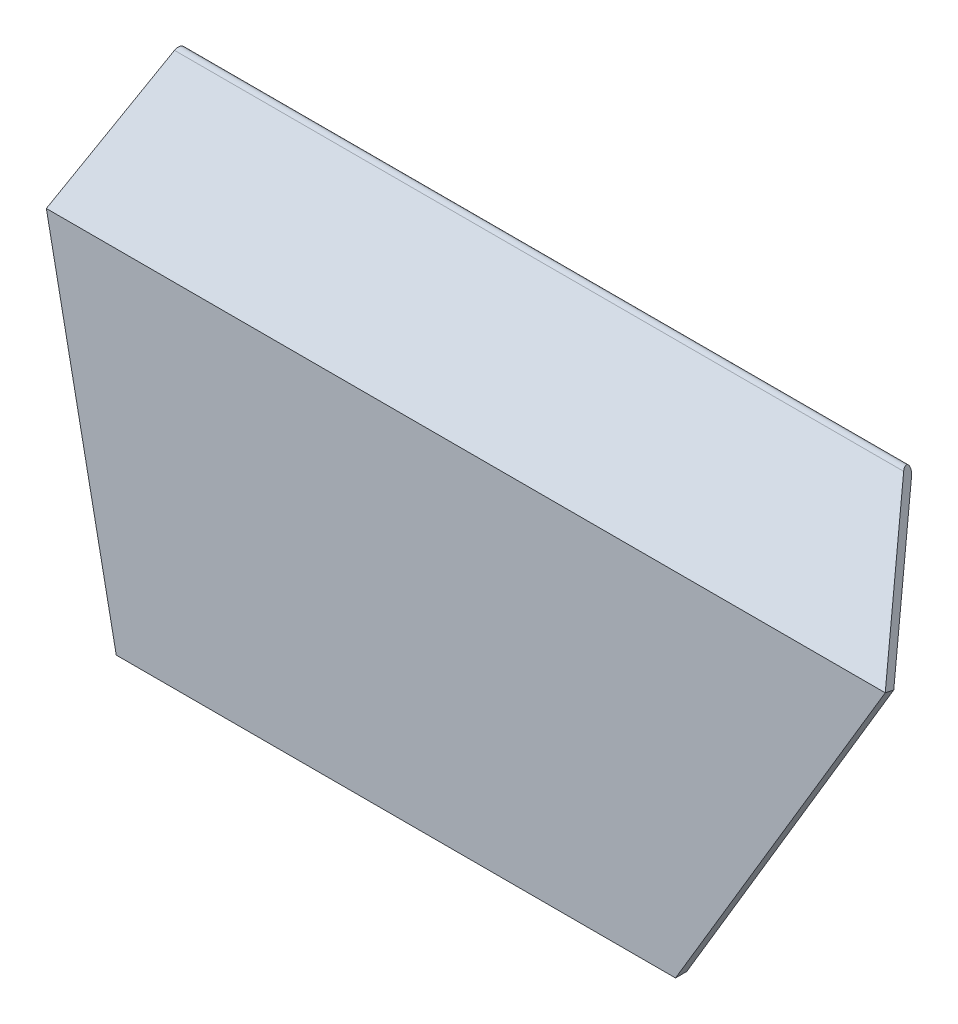
ISO-10303-21;
HEADER;
FILE_DESCRIPTION(('STEP AP214'),'2;1');
FILE_NAME('part.step','',(''),(''),'','','');
FILE_SCHEMA(('AUTOMOTIVE_DESIGN { 1 0 10303 214 1 1 1 1 }'));
ENDSEC;
DATA;
#1=APPLICATION_CONTEXT('core data for automotive mechanical design processes');
#2=APPLICATION_PROTOCOL_DEFINITION('international standard','automotive_design',2000,#1);
#3=PRODUCT_CONTEXT('',#1,'mechanical');
#4=PRODUCT('Part','Part','',(#3));
#5=PRODUCT_RELATED_PRODUCT_CATEGORY('part','',(#4));
#6=PRODUCT_DEFINITION_FORMATION('','',#4);
#7=PRODUCT_DEFINITION_CONTEXT('part definition',#1,'design');
#8=PRODUCT_DEFINITION('design','',#6,#7);
#9=PRODUCT_DEFINITION_SHAPE('','',#8);
#10=(LENGTH_UNIT() NAMED_UNIT(*) SI_UNIT(.MILLI.,.METRE.));
#11=(NAMED_UNIT(*) PLANE_ANGLE_UNIT() SI_UNIT($,.RADIAN.));
#12=(NAMED_UNIT(*) SI_UNIT($,.STERADIAN.) SOLID_ANGLE_UNIT());
#13=UNCERTAINTY_MEASURE_WITH_UNIT(LENGTH_MEASURE(1.E-05),#10,'distance_accuracy_value','');
#14=(GEOMETRIC_REPRESENTATION_CONTEXT(3) GLOBAL_UNCERTAINTY_ASSIGNED_CONTEXT((#13)) GLOBAL_UNIT_ASSIGNED_CONTEXT((#10,
#11,#12)) REPRESENTATION_CONTEXT('',''));
#15=CARTESIAN_POINT('',(0.,0.,0.));
#16=DIRECTION('',(0.,0.,1.));
#17=DIRECTION('',(1.,0.,0.));
#18=AXIS2_PLACEMENT_3D('',#15,#16,#17);
#19=CARTESIAN_POINT('',(600.,0.,8.));
#20=DIRECTION('',(0.,1.,0.));
#21=DIRECTION('',(0.,0.,1.));
#22=AXIS2_PLACEMENT_3D('',#19,#20,#21);
#23=PLANE('',#22);
#24=DIRECTION('',(-1.,0.,0.));
#25=VECTOR('',#24,1.);
#26=CARTESIAN_POINT('',(600.,0.,8.));
#27=LINE('',#26,#25);
#28=CARTESIAN_POINT('',(300.,1.09287578986539E-13,8.));
#29=VERTEX_POINT('',#28);
#30=CARTESIAN_POINT('',(-500.,0.,8.));
#31=VERTEX_POINT('',#30);
#32=EDGE_CURVE('E131',#29,#31,#27,.T.);
#33=ORIENTED_EDGE('',*,*,#32,.T.);
#34=DIRECTION('',(0.,0.,1.));
#35=VECTOR('',#34,1.);
#36=CARTESIAN_POINT('',(-500.,0.,-593.939151416767));
#37=LINE('',#36,#35);
#38=CARTESIAN_POINT('',(-500.,0.,-8.00000000000001));
#39=VERTEX_POINT('',#38);
#40=EDGE_CURVE('E122',#39,#31,#37,.T.);
#41=ORIENTED_EDGE('',*,*,#40,.F.);
#42=DIRECTION('',(-1.,0.,0.));
#43=VECTOR('',#42,1.);
#44=CARTESIAN_POINT('',(600.,0.,-8.));
#45=LINE('',#44,#43);
#46=CARTESIAN_POINT('',(300.,1.09287578986539E-13,-8.00000000000001));
#47=VERTEX_POINT('',#46);
#48=EDGE_CURVE('E143',#47,#39,#45,.T.);
#49=ORIENTED_EDGE('',*,*,#48,.F.);
#50=DIRECTION('',(0.,0.,1.));
#51=VECTOR('',#50,1.);
#52=CARTESIAN_POINT('',(300.,1.09287578986539E-13,-593.939151416767));
#53=LINE('',#52,#51);
#54=EDGE_CURVE('E175',#47,#29,#53,.T.);
#55=ORIENTED_EDGE('',*,*,#54,.T.);
#56=EDGE_LOOP('',(#33,#41,#49,#55));
#57=FACE_BOUND('',#56,.T.);
#58=ADVANCED_FACE('F36',(#57),#23,.F.);
#59=CARTESIAN_POINT('',(600.,0.,-8.));
#60=DIRECTION('',(0.,0.,1.));
#61=DIRECTION('',(1.,0.,0.));
#62=AXIS2_PLACEMENT_3D('',#59,#60,#61);
#63=PLANE('',#62);
#64=CARTESIAN_POINT('',(-176.078720832928,79.0205346036378,-8.));
#65=DIRECTION('',(0.,0.,-1.));
#66=DIRECTION('',(-1.,0.,0.));
#67=AXIS2_PLACEMENT_3D('',#64,#65,#66);
#68=CIRCLE('',#67,16.);
#69=CARTESIAN_POINT('',(-192.078720832928,79.0205346036378,-8.));
#70=VERTEX_POINT('',#69);
#71=EDGE_CURVE('E369',#70,#70,#68,.T.);
#72=ORIENTED_EDGE('',*,*,#71,.F.);
#73=EDGE_LOOP('',(#72));
#74=FACE_BOUND('',#73,.T.);
#75=CARTESIAN_POINT('',(-430.637162060085,333.578975830795,-8.));
#76=DIRECTION('',(0.,0.,-1.));
#77=DIRECTION('',(-1.,0.,0.));
#78=AXIS2_PLACEMENT_3D('',#75,#76,#77);
#79=CIRCLE('',#78,16.);
#80=CARTESIAN_POINT('',(-446.637162060085,333.578975830795,-8.));
#81=VERTEX_POINT('',#80);
#82=EDGE_CURVE('E382',#81,#81,#79,.T.);
#83=ORIENTED_EDGE('',*,*,#82,.F.);
#84=EDGE_LOOP('',(#83));
#85=FACE_BOUND('',#84,.T.);
#86=CARTESIAN_POINT('',(-430.637162060085,79.0205346036377,-8.));
#87=DIRECTION('',(0.,0.,-1.));
#88=DIRECTION('',(-1.,0.,0.));
#89=AXIS2_PLACEMENT_3D('',#86,#87,#88);
#90=CIRCLE('',#89,16.);
#91=CARTESIAN_POINT('',(-446.637162060085,79.0205346036377,-8.));
#92=VERTEX_POINT('',#91);
#93=EDGE_CURVE('E377',#92,#92,#90,.T.);
#94=ORIENTED_EDGE('',*,*,#93,.F.);
#95=EDGE_LOOP('',(#94));
#96=FACE_BOUND('',#95,.T.);
#97=CARTESIAN_POINT('',(-176.078720832928,333.578975830795,-8.));
#98=DIRECTION('',(0.,0.,-1.));
#99=DIRECTION('',(-1.,0.,0.));
#100=AXIS2_PLACEMENT_3D('',#97,#98,#99);
#101=CIRCLE('',#100,16.0000000000001);
#102=CARTESIAN_POINT('',(-192.078720832928,333.578975830795,-8.));
#103=VERTEX_POINT('',#102);
#104=EDGE_CURVE('E368',#103,#103,#101,.T.);
#105=ORIENTED_EDGE('',*,*,#104,.F.);
#106=EDGE_LOOP('',(#105));
#107=FACE_BOUND('',#106,.T.);
#108=ORIENTED_EDGE('',*,*,#48,.T.);
#109=DIRECTION('',(0.194874139230408,-0.980828257066041,0.));
#110=VECTOR('',#109,1.);
#111=CARTESIAN_POINT('',(-600.,503.313708498985,-8.00000000000001));
#112=LINE('',#111,#110);
#113=CARTESIAN_POINT('',(-598.683243296167,496.686291501015,-8.));
#114=VERTEX_POINT('',#113);
#115=EDGE_CURVE('E171',#114,#39,#112,.T.);
#116=ORIENTED_EDGE('',*,*,#115,.F.);
#117=DIRECTION('',(-1.,0.,0.));
#118=VECTOR('',#117,1.);
#119=CARTESIAN_POINT('',(600.,496.686291501015,-8.));
#120=LINE('',#119,#118);
#121=CARTESIAN_POINT('',(596.049729888502,496.686291501015,-8.));
#122=VERTEX_POINT('',#121);
#123=EDGE_CURVE('E141',#122,#114,#120,.T.);
#124=ORIENTED_EDGE('',*,*,#123,.F.);
#125=DIRECTION('',(0.511998556974077,0.858986308189172,0.));
#126=VECTOR('',#125,1.);
#127=CARTESIAN_POINT('',(600.,503.313708498985,-8.00000000000001));
#128=LINE('',#127,#126);
#129=EDGE_CURVE('E126',#47,#122,#128,.T.);
#130=ORIENTED_EDGE('',*,*,#129,.F.);
#131=EDGE_LOOP('',(#108,#116,#124,#130));
#132=FACE_BOUND('',#131,.T.);
#133=ADVANCED_FACE('F184',(#74,#85,#96,#107,#132),#63,.F.);
#134=CARTESIAN_POINT('',(600.,496.686291501015,-8.));
#135=DIRECTION('',(0.,0.707106781186548,0.707106781186547));
#136=DIRECTION('',(0.,-0.707106781186547,0.707106781186548));
#137=AXIS2_PLACEMENT_3D('',#134,#135,#136);
#138=PLANE('',#137);
#139=DIRECTION('',(-1.,0.,0.));
#140=VECTOR('',#139,1.);
#141=CARTESIAN_POINT('',(600.,635.764501987817,-147.078210486802));
#142=LINE('',#141,#140);
#143=CARTESIAN_POINT('',(482.616775668172,635.764501987817,-147.078210486802));
#144=VERTEX_POINT('',#143);
#145=CARTESIAN_POINT('',(-560.479818490033,635.764501987817,-147.078210486802));
#146=VERTEX_POINT('',#145);
#147=EDGE_CURVE('E133',#144,#146,#142,.T.);
#148=ORIENTED_EDGE('',*,*,#147,.F.);
#149=DIRECTION('',(-0.499999999999995,0.612372435695796,-0.612372435695797));
#150=VECTOR('',#149,1.);
#151=CARTESIAN_POINT('',(600.,492.,-3.31370849898471));
#152=LINE('',#151,#150);
#153=CARTESIAN_POINT('',(596.17365901219,496.686291501015,-8.));
#154=VERTEX_POINT('',#153);
#155=EDGE_CURVE('E161',#154,#144,#152,.T.);
#156=ORIENTED_EDGE('',*,*,#155,.F.);
#157=EDGE_CURVE('E57',#154,#122,#120,.T.);
#158=ORIENTED_EDGE('',*,*,#157,.T.);
#159=ORIENTED_EDGE('',*,*,#123,.T.);
#160=DIRECTION('',(1.,0.,0.));
#161=VECTOR('',#160,1.);
#162=CARTESIAN_POINT('',(600.,496.686291501015,-8.));
#163=LINE('',#162,#161);
#164=CARTESIAN_POINT('',(-598.71176063515,496.686291501015,-8.00000000000001));
#165=VERTEX_POINT('',#164);
#166=EDGE_CURVE('E135',#165,#114,#163,.T.);
#167=ORIENTED_EDGE('',*,*,#166,.F.);
#168=DIRECTION('',(-0.190808995376538,-0.694115238012895,0.694115238012895));
#169=VECTOR('',#168,1.);
#170=CARTESIAN_POINT('',(-600.,492.,-3.31370849898474));
#171=LINE('',#170,#169);
#172=EDGE_CURVE('E115',#146,#165,#171,.T.);
#173=ORIENTED_EDGE('',*,*,#172,.F.);
#174=EDGE_LOOP('',(#148,#156,#158,#159,#167,#173));
#175=FACE_BOUND('',#174,.T.);
#176=ADVANCED_FACE('F188',(#175),#138,.F.);
#177=CARTESIAN_POINT('',(600.,641.421356237309,-141.421356237309));
#178=DIRECTION('',(-1.,0.,0.));
#179=DIRECTION('',(0.,0.,1.));
#180=AXIS2_PLACEMENT_3D('',#177,#178,#179);
#181=CYLINDRICAL_SURFACE('',#180,7.99999999999999);
#182=CARTESIAN_POINT('',(482.616775668172,641.421356237309,-141.421356237309));
#183=DIRECTION('',(-0.866025403784442,-0.35355339059327,0.35355339059327));
#184=DIRECTION('',(-0.499999999999995,0.612372435695797,-0.612372435695797));
#185=AXIS2_PLACEMENT_3D('',#182,#183,#184);
#186=ELLIPSE('',#185,9.23760430703397,7.99999999999999);
#187=CARTESIAN_POINT('',(482.616775668172,647.078210486802,-135.764501987817));
#188=VERTEX_POINT('',#187);
#189=EDGE_CURVE('E160',#188,#144,#186,.T.);
#190=ORIENTED_EDGE('',*,*,#189,.T.);
#191=ORIENTED_EDGE('',*,*,#147,.T.);
#192=CARTESIAN_POINT('',(-560.479818490033,641.421356237309,-141.421356237309));
#193=DIRECTION('',(0.981627183447665,-0.134922334542143,0.134922334542143));
#194=DIRECTION('',(-0.190808995376538,-0.694115238012895,0.694115238012895));
#195=AXIS2_PLACEMENT_3D('',#192,#193,#194);
#196=ELLIPSE('',#195,8.1497335596417,7.99999999999999);
#197=CARTESIAN_POINT('',(-560.479818490033,647.078210486802,-135.764501987817));
#198=VERTEX_POINT('',#197);
#199=EDGE_CURVE('E168',#146,#198,#196,.T.);
#200=ORIENTED_EDGE('',*,*,#199,.T.);
#201=DIRECTION('',(-1.,0.,0.));
#202=VECTOR('',#201,1.);
#203=CARTESIAN_POINT('',(600.,647.078210486802,-135.764501987817));
#204=LINE('',#203,#202);
#205=EDGE_CURVE('E114',#188,#198,#204,.T.);
#206=ORIENTED_EDGE('',*,*,#205,.F.);
#207=EDGE_LOOP('',(#190,#191,#200,#206));
#208=FACE_BOUND('',#207,.T.);
#209=ADVANCED_FACE('F190',(#208),#181,.T.);
#210=CARTESIAN_POINT('',(600.,503.313708498985,8.));
#211=DIRECTION('',(0.,-0.707106781186547,-0.707106781186547));
#212=DIRECTION('',(0.,0.707106781186548,-0.707106781186548));
#213=AXIS2_PLACEMENT_3D('',#210,#211,#212);
#214=PLANE('',#213);
#215=DIRECTION('',(-1.,0.,0.));
#216=VECTOR('',#215,1.);
#217=CARTESIAN_POINT('',(600.,503.313708498985,8.));
#218=LINE('',#217,#216);
#219=CARTESIAN_POINT('',(600.,503.313708498985,8.));
#220=VERTEX_POINT('',#219);
#221=CARTESIAN_POINT('',(-600.,503.313708498985,7.99999999999998));
#222=VERTEX_POINT('',#221);
#223=EDGE_CURVE('E112',#220,#222,#218,.T.);
#224=ORIENTED_EDGE('',*,*,#223,.F.);
#225=DIRECTION('',(0.499999999999995,-0.612372435695797,0.612372435695797));
#226=VECTOR('',#225,1.);
#227=CARTESIAN_POINT('',(600.,503.313708498985,7.99999999999998));
#228=LINE('',#227,#226);
#229=EDGE_CURVE('E157',#188,#220,#228,.T.);
#230=ORIENTED_EDGE('',*,*,#229,.F.);
#231=ORIENTED_EDGE('',*,*,#205,.T.);
#232=DIRECTION('',(0.190808995376538,0.694115238012895,-0.694115238012895));
#233=VECTOR('',#232,1.);
#234=CARTESIAN_POINT('',(-600.,503.313708498985,7.99999999999998));
#235=LINE('',#234,#233);
#236=EDGE_CURVE('E101',#222,#198,#235,.T.);
#237=ORIENTED_EDGE('',*,*,#236,.F.);
#238=EDGE_LOOP('',(#224,#230,#231,#237));
#239=FACE_BOUND('',#238,.T.);
#240=ADVANCED_FACE('F109',(#239),#214,.F.);
#241=CARTESIAN_POINT('',(600.,0.,8.));
#242=DIRECTION('',(0.,0.,-1.));
#243=DIRECTION('',(-1.,0.,0.));
#244=AXIS2_PLACEMENT_3D('',#241,#242,#243);
#245=PLANE('',#244);
#246=ORIENTED_EDGE('',*,*,#223,.T.);
#247=DIRECTION('',(-0.194874139230408,0.980828257066041,0.));
#248=VECTOR('',#247,1.);
#249=CARTESIAN_POINT('',(-600.,503.313708498985,8.));
#250=LINE('',#249,#248);
#251=EDGE_CURVE('E119',#31,#222,#250,.T.);
#252=ORIENTED_EDGE('',*,*,#251,.F.);
#253=ORIENTED_EDGE('',*,*,#32,.F.);
#254=DIRECTION('',(-0.511998556974077,-0.858986308189172,0.));
#255=VECTOR('',#254,1.);
#256=CARTESIAN_POINT('',(600.,503.313708498985,8.));
#257=LINE('',#256,#255);
#258=EDGE_CURVE('E130',#220,#29,#257,.T.);
#259=ORIENTED_EDGE('',*,*,#258,.F.);
#260=EDGE_LOOP('',(#246,#252,#253,#259));
#261=FACE_BOUND('',#260,.T.);
#262=ADVANCED_FACE('F129',(#261),#245,.F.);
#263=CARTESIAN_POINT('',(600.,0.,-8.));
#264=DIRECTION('',(0.,0.,1.));
#265=DIRECTION('',(1.,0.,0.));
#266=AXIS2_PLACEMENT_3D('',#263,#264,#265);
#267=PLANE('',#266);
#268=DIRECTION('',(0.136167425368275,0.990685839339887,0.));
#269=VECTOR('',#268,1.);
#270=CARTESIAN_POINT('',(-643.488318953711,170.91452824265,-8.));
#271=LINE('',#270,#269);
#272=CARTESIAN_POINT('',(-598.700099579746,496.771131487009,-8.00000000000004));
#273=VERTEX_POINT('',#272);
#274=EDGE_CURVE('E50',#165,#273,#271,.T.);
#275=ORIENTED_EDGE('',*,*,#274,.F.);
#276=ORIENTED_EDGE('',*,*,#166,.T.);
#277=EDGE_CURVE('E170',#273,#114,#112,.T.);
#278=ORIENTED_EDGE('',*,*,#277,.F.);
#279=EDGE_LOOP('',(#275,#276,#278));
#280=FACE_BOUND('',#279,.T.);
#281=ADVANCED_FACE('F179',(#280),#267,.T.);
#282=CARTESIAN_POINT('',(-600.,503.313708498985,-593.939151416767));
#283=DIRECTION('',(0.980828257066041,0.194874139230408,0.));
#284=DIRECTION('',(-0.194874139230408,0.980828257066041,0.));
#285=AXIS2_PLACEMENT_3D('',#282,#283,#284);
#286=PLANE('',#285);
#287=ORIENTED_EDGE('',*,*,#251,.T.);
#288=DIRECTION('',(0.0749879393279619,-0.377424578358534,-0.922999185593481));
#289=VECTOR('',#288,1.);
#290=CARTESIAN_POINT('',(-558.337499790808,293.620633642705,-504.808514375764));
#291=LINE('',#290,#289);
#292=EDGE_CURVE('E11',#222,#273,#291,.T.);
#293=ORIENTED_EDGE('',*,*,#292,.T.);
#294=ORIENTED_EDGE('',*,*,#277,.T.);
#295=ORIENTED_EDGE('',*,*,#115,.T.);
#296=ORIENTED_EDGE('',*,*,#40,.T.);
#297=EDGE_LOOP('',(#287,#293,#294,#295,#296));
#298=FACE_BOUND('',#297,.T.);
#299=ADVANCED_FACE('F120',(#298),#286,.F.);
#300=CARTESIAN_POINT('',(600.,0.,-8.));
#301=DIRECTION('',(0.,0.,1.));
#302=DIRECTION('',(1.,0.,0.));
#303=AXIS2_PLACEMENT_3D('',#300,#301,#302);
#304=PLANE('',#303);
#305=DIRECTION('',(0.377964473009223,-0.925820099772553,0.));
#306=VECTOR('',#305,1.);
#307=CARTESIAN_POINT('',(770.524275783697,69.6162440712819,-8.));
#308=LINE('',#307,#306);
#309=CARTESIAN_POINT('',(596.123281682096,496.809690254351,-7.9999999999999));
#310=VERTEX_POINT('',#309);
#311=EDGE_CURVE('E156',#310,#154,#308,.T.);
#312=ORIENTED_EDGE('',*,*,#311,.F.);
#313=EDGE_CURVE('E151',#122,#310,#128,.T.);
#314=ORIENTED_EDGE('',*,*,#313,.F.);
#315=ORIENTED_EDGE('',*,*,#157,.F.);
#316=EDGE_LOOP('',(#312,#314,#315));
#317=FACE_BOUND('',#316,.T.);
#318=ADVANCED_FACE('F159',(#317),#304,.T.);
#319=CARTESIAN_POINT('',(600.,503.313708498985,-593.939151416767));
#320=DIRECTION('',(-0.858986308189172,0.511998556974077,0.));
#321=DIRECTION('',(-0.511998556974077,-0.858986308189172,0.));
#322=AXIS2_PLACEMENT_3D('',#319,#320,#321);
#323=PLANE('',#322);
#324=ORIENTED_EDGE('',*,*,#313,.T.);
#325=DIRECTION('',(0.21900923418364,0.367434499508301,0.903895372215933));
#326=VECTOR('',#325,1.);
#327=CARTESIAN_POINT('',(480.839262855557,303.396266766844,-483.800445109939));
#328=LINE('',#327,#326);
#329=EDGE_CURVE('E43',#310,#220,#328,.T.);
#330=ORIENTED_EDGE('',*,*,#329,.T.);
#331=ORIENTED_EDGE('',*,*,#258,.T.);
#332=ORIENTED_EDGE('',*,*,#54,.F.);
#333=ORIENTED_EDGE('',*,*,#129,.T.);
#334=EDGE_LOOP('',(#324,#330,#331,#332,#333));
#335=FACE_BOUND('',#334,.T.);
#336=ADVANCED_FACE('F148',(#335),#323,.F.);
#337=CARTESIAN_POINT('',(600.,319.463079507421,-175.850628991563));
#338=DIRECTION('',(-0.866025403784442,-0.35355339059327,0.35355339059327));
#339=DIRECTION('',(0.377964473009223,0.,0.925820099772553));
#340=AXIS2_PLACEMENT_3D('',#337,#338,#339);
#341=PLANE('',#340);
#342=ORIENTED_EDGE('',*,*,#189,.F.);
#343=ORIENTED_EDGE('',*,*,#229,.T.);
#344=ORIENTED_EDGE('',*,*,#329,.F.);
#345=ORIENTED_EDGE('',*,*,#311,.T.);
#346=ORIENTED_EDGE('',*,*,#155,.T.);
#347=EDGE_LOOP('',(#342,#343,#344,#345,#346));
#348=FACE_BOUND('',#347,.T.);
#349=ADVANCED_FACE('F154',(#348),#341,.F.);
#350=CARTESIAN_POINT('',(-600.,319.463079507421,-175.850628991563));
#351=DIRECTION('',(0.981627183447665,-0.134922334542143,0.134922334542143));
#352=DIRECTION('',(0.136167425368275,0.,-0.990685839339887));
#353=AXIS2_PLACEMENT_3D('',#350,#351,#352);
#354=PLANE('',#353);
#355=ORIENTED_EDGE('',*,*,#172,.T.);
#356=ORIENTED_EDGE('',*,*,#274,.T.);
#357=ORIENTED_EDGE('',*,*,#292,.F.);
#358=ORIENTED_EDGE('',*,*,#236,.T.);
#359=ORIENTED_EDGE('',*,*,#199,.F.);
#360=EDGE_LOOP('',(#355,#356,#357,#358,#359));
#361=FACE_BOUND('',#360,.T.);
#362=ADVANCED_FACE('F100',(#361),#354,.F.);
#363=CARTESIAN_POINT('',(-176.078720832928,333.578975830795,-4.));
#364=DIRECTION('',(0.,0.,-1.));
#365=DIRECTION('',(-1.,0.,0.));
#366=AXIS2_PLACEMENT_3D('',#363,#364,#365);
#367=CYLINDRICAL_SURFACE('',#366,16.0000000000001);
#368=CARTESIAN_POINT('',(-176.078720832928,333.578975830795,-4.));
#369=DIRECTION('',(0.,0.,-1.));
#370=DIRECTION('',(-1.,0.,0.));
#371=AXIS2_PLACEMENT_3D('',#368,#369,#370);
#372=CIRCLE('',#371,16.0000000000001);
#373=CARTESIAN_POINT('',(-192.078720832928,333.578975830795,-4.));
#374=VERTEX_POINT('',#373);
#375=EDGE_CURVE('E116',#374,#374,#372,.T.);
#376=ORIENTED_EDGE('',*,*,#375,.F.);
#377=EDGE_LOOP('',(#376));
#378=FACE_BOUND('',#377,.T.);
#379=ORIENTED_EDGE('',*,*,#104,.T.);
#380=EDGE_LOOP('',(#379));
#381=FACE_BOUND('',#380,.T.);
#382=ADVANCED_FACE('F218',(#378,#381),#367,.F.);
#383=CARTESIAN_POINT('',(-176.078720832928,333.578975830795,-4.));
#384=DIRECTION('',(0.,0.,-1.));
#385=DIRECTION('',(-1.,0.,0.));
#386=AXIS2_PLACEMENT_3D('',#383,#384,#385);
#387=PLANE('',#386);
#388=ORIENTED_EDGE('',*,*,#375,.T.);
#389=EDGE_LOOP('',(#388));
#390=FACE_BOUND('',#389,.T.);
#391=ADVANCED_FACE('F223',(#390),#387,.T.);
#392=CARTESIAN_POINT('',(-430.637162060085,79.0205346036377,-4.));
#393=DIRECTION('',(0.,0.,-1.));
#394=DIRECTION('',(-1.,0.,0.));
#395=AXIS2_PLACEMENT_3D('',#392,#393,#394);
#396=CYLINDRICAL_SURFACE('',#395,16.);
#397=CARTESIAN_POINT('',(-430.637162060085,79.0205346036377,-4.));
#398=DIRECTION('',(0.,0.,-1.));
#399=DIRECTION('',(-1.,0.,0.));
#400=AXIS2_PLACEMENT_3D('',#397,#398,#399);
#401=CIRCLE('',#400,16.);
#402=CARTESIAN_POINT('',(-446.637162060085,79.0205346036377,-4.));
#403=VERTEX_POINT('',#402);
#404=EDGE_CURVE('E385',#403,#403,#401,.T.);
#405=ORIENTED_EDGE('',*,*,#404,.F.);
#406=EDGE_LOOP('',(#405));
#407=FACE_BOUND('',#406,.T.);
#408=ORIENTED_EDGE('',*,*,#93,.T.);
#409=EDGE_LOOP('',(#408));
#410=FACE_BOUND('',#409,.T.);
#411=ADVANCED_FACE('F233',(#407,#410),#396,.F.);
#412=CARTESIAN_POINT('',(-430.637162060085,79.0205346036377,-4.));
#413=DIRECTION('',(0.,0.,-1.));
#414=DIRECTION('',(-1.,0.,0.));
#415=AXIS2_PLACEMENT_3D('',#412,#413,#414);
#416=PLANE('',#415);
#417=ORIENTED_EDGE('',*,*,#404,.T.);
#418=EDGE_LOOP('',(#417));
#419=FACE_BOUND('',#418,.T.);
#420=ADVANCED_FACE('F243',(#419),#416,.T.);
#421=CARTESIAN_POINT('',(-430.637162060085,333.578975830795,-4.));
#422=DIRECTION('',(0.,0.,-1.));
#423=DIRECTION('',(-1.,0.,0.));
#424=AXIS2_PLACEMENT_3D('',#421,#422,#423);
#425=CYLINDRICAL_SURFACE('',#424,16.);
#426=CARTESIAN_POINT('',(-430.637162060085,333.578975830795,-4.));
#427=DIRECTION('',(0.,0.,-1.));
#428=DIRECTION('',(-1.,0.,0.));
#429=AXIS2_PLACEMENT_3D('',#426,#427,#428);
#430=CIRCLE('',#429,16.);
#431=CARTESIAN_POINT('',(-446.637162060085,333.578975830795,-4.));
#432=VERTEX_POINT('',#431);
#433=EDGE_CURVE('E374',#432,#432,#430,.T.);
#434=ORIENTED_EDGE('',*,*,#433,.F.);
#435=EDGE_LOOP('',(#434));
#436=FACE_BOUND('',#435,.T.);
#437=ORIENTED_EDGE('',*,*,#82,.T.);
#438=EDGE_LOOP('',(#437));
#439=FACE_BOUND('',#438,.T.);
#440=ADVANCED_FACE('F253',(#436,#439),#425,.F.);
#441=CARTESIAN_POINT('',(-430.637162060085,333.578975830795,-4.));
#442=DIRECTION('',(0.,0.,-1.));
#443=DIRECTION('',(-1.,0.,0.));
#444=AXIS2_PLACEMENT_3D('',#441,#442,#443);
#445=PLANE('',#444);
#446=ORIENTED_EDGE('',*,*,#433,.T.);
#447=EDGE_LOOP('',(#446));
#448=FACE_BOUND('',#447,.T.);
#449=ADVANCED_FACE('F263',(#448),#445,.T.);
#450=CARTESIAN_POINT('',(-176.078720832928,79.0205346036378,-4.));
#451=DIRECTION('',(0.,0.,-1.));
#452=DIRECTION('',(-1.,0.,0.));
#453=AXIS2_PLACEMENT_3D('',#450,#451,#452);
#454=CYLINDRICAL_SURFACE('',#453,16.);
#455=CARTESIAN_POINT('',(-176.078720832928,79.0205346036378,-4.));
#456=DIRECTION('',(0.,0.,-1.));
#457=DIRECTION('',(-1.,0.,0.));
#458=AXIS2_PLACEMENT_3D('',#455,#456,#457);
#459=CIRCLE('',#458,16.);
#460=CARTESIAN_POINT('',(-192.078720832928,79.0205346036378,-4.));
#461=VERTEX_POINT('',#460);
#462=EDGE_CURVE('E367',#461,#461,#459,.T.);
#463=ORIENTED_EDGE('',*,*,#462,.F.);
#464=EDGE_LOOP('',(#463));
#465=FACE_BOUND('',#464,.T.);
#466=ORIENTED_EDGE('',*,*,#71,.T.);
#467=EDGE_LOOP('',(#466));
#468=FACE_BOUND('',#467,.T.);
#469=ADVANCED_FACE('F273',(#465,#468),#454,.F.);
#470=CARTESIAN_POINT('',(-176.078720832928,79.0205346036378,-4.));
#471=DIRECTION('',(0.,0.,-1.));
#472=DIRECTION('',(-1.,0.,0.));
#473=AXIS2_PLACEMENT_3D('',#470,#471,#472);
#474=PLANE('',#473);
#475=ORIENTED_EDGE('',*,*,#462,.T.);
#476=EDGE_LOOP('',(#475));
#477=FACE_BOUND('',#476,.T.);
#478=ADVANCED_FACE('F283',(#477),#474,.T.);
#479=CLOSED_SHELL('',(#58,#133,#176,#209,#240,#262,#281,#299,#318,#336,#349,#362,#382,#391,#411,
#420,#440,#449,#469,#478));
#480=MANIFOLD_SOLID_BREP('B2',#479);
#481=ADVANCED_BREP_SHAPE_REPRESENTATION('',(#18,#480),#14);
#482=SHAPE_DEFINITION_REPRESENTATION(#9,#481);
ENDSEC;
END-ISO-10303-21;
